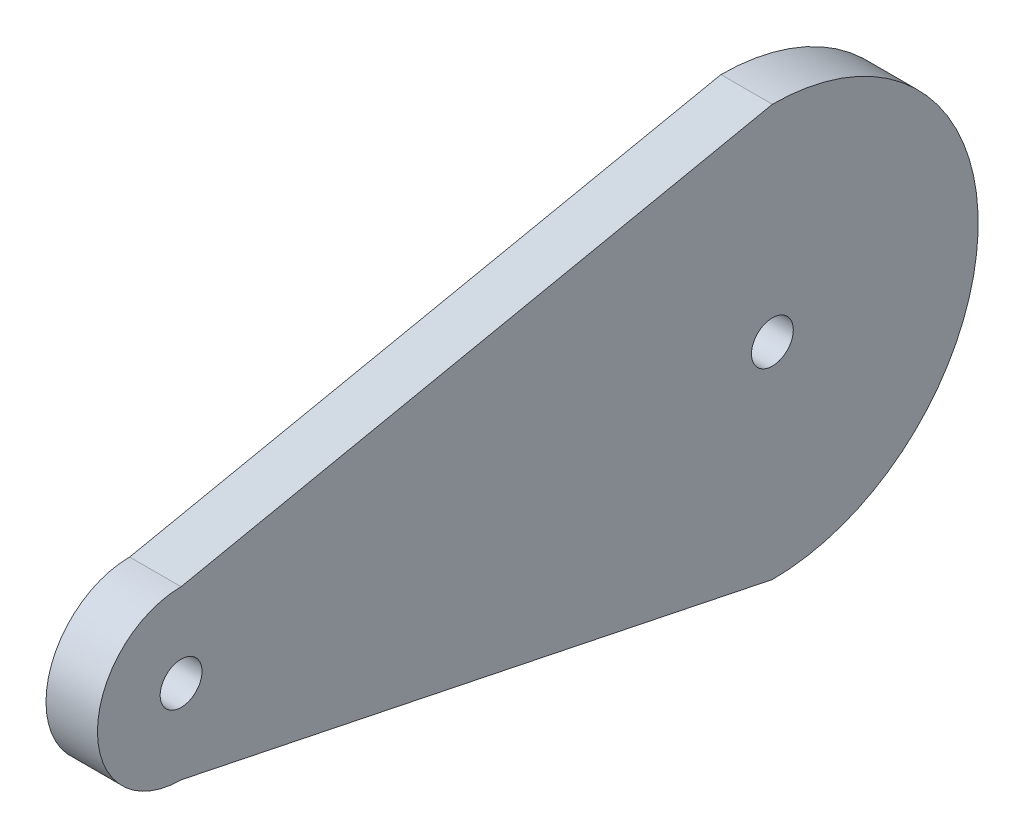
ISO-10303-21;
HEADER;
FILE_DESCRIPTION(('STEP AP214'),'2;1');
FILE_NAME('part.step','',(''),(''),'','','');
FILE_SCHEMA(('AUTOMOTIVE_DESIGN { 1 0 10303 214 1 1 1 1 }'));
ENDSEC;
DATA;
#1=APPLICATION_CONTEXT('core data for automotive mechanical design processes');
#2=APPLICATION_PROTOCOL_DEFINITION('international standard','automotive_design',2000,#1);
#3=PRODUCT_CONTEXT('',#1,'mechanical');
#4=PRODUCT('Part','Part','',(#3));
#5=PRODUCT_RELATED_PRODUCT_CATEGORY('part','',(#4));
#6=PRODUCT_DEFINITION_FORMATION('','',#4);
#7=PRODUCT_DEFINITION_CONTEXT('part definition',#1,'design');
#8=PRODUCT_DEFINITION('design','',#6,#7);
#9=PRODUCT_DEFINITION_SHAPE('','',#8);
#10=(LENGTH_UNIT() NAMED_UNIT(*) SI_UNIT(.MILLI.,.METRE.));
#11=(NAMED_UNIT(*) PLANE_ANGLE_UNIT() SI_UNIT($,.RADIAN.));
#12=(NAMED_UNIT(*) SI_UNIT($,.STERADIAN.) SOLID_ANGLE_UNIT());
#13=UNCERTAINTY_MEASURE_WITH_UNIT(LENGTH_MEASURE(1.E-05),#10,'distance_accuracy_value','');
#14=(GEOMETRIC_REPRESENTATION_CONTEXT(3) GLOBAL_UNCERTAINTY_ASSIGNED_CONTEXT((#13)) GLOBAL_UNIT_ASSIGNED_CONTEXT((#10,
#11,#12)) REPRESENTATION_CONTEXT('',''));
#15=CARTESIAN_POINT('',(0.,0.,0.));
#16=DIRECTION('',(0.,0.,1.));
#17=DIRECTION('',(1.,0.,0.));
#18=AXIS2_PLACEMENT_3D('',#15,#16,#17);
#19=CARTESIAN_POINT('',(6.35,-9.90068513488219,2.04551349423278));
#20=DIRECTION('',(0.,0.979317373878997,-0.202330129290586));
#21=DIRECTION('',(0.,0.202330129290586,0.979317373878997));
#22=AXIS2_PLACEMENT_3D('',#19,#20,#21);
#23=PLANE('',#22);
#24=DIRECTION('',(0.,-0.202330129290586,-0.979317373878997));
#25=VECTOR('',#24,1.);
#26=CARTESIAN_POINT('',(0.,-9.90068513488219,2.04551349423278));
#27=LINE('',#26,#25);
#28=CARTESIAN_POINT('',(0.,-10.3232948228064,0.));
#29=VERTEX_POINT('',#28);
#30=CARTESIAN_POINT('',(0.,-25.4,-72.9742));
#31=VERTEX_POINT('',#30);
#32=EDGE_CURVE('E117',#29,#31,#27,.T.);
#33=ORIENTED_EDGE('',*,*,#32,.T.);
#34=DIRECTION('',(-1.,0.,0.));
#35=VECTOR('',#34,1.);
#36=CARTESIAN_POINT('',(6.35,-25.4,-72.9742));
#37=LINE('',#36,#35);
#38=CARTESIAN_POINT('',(6.35,-25.4,-72.9742));
#39=VERTEX_POINT('',#38);
#40=EDGE_CURVE('E11',#39,#31,#37,.T.);
#41=ORIENTED_EDGE('',*,*,#40,.F.);
#42=DIRECTION('',(0.,-0.202330129290586,-0.979317373878997));
#43=VECTOR('',#42,1.);
#44=CARTESIAN_POINT('',(6.35,-9.90068513488219,2.04551349423278));
#45=LINE('',#44,#43);
#46=CARTESIAN_POINT('',(6.35,-10.3232948228064,0.));
#47=VERTEX_POINT('',#46);
#48=EDGE_CURVE('E90',#47,#39,#45,.T.);
#49=ORIENTED_EDGE('',*,*,#48,.F.);
#50=DIRECTION('',(-1.,0.,0.));
#51=VECTOR('',#50,1.);
#52=CARTESIAN_POINT('',(6.35,-10.3232948228064,0.));
#53=LINE('',#52,#51);
#54=EDGE_CURVE('E116',#47,#29,#53,.T.);
#55=ORIENTED_EDGE('',*,*,#54,.T.);
#56=EDGE_LOOP('',(#33,#41,#49,#55));
#57=FACE_BOUND('',#56,.T.);
#58=ADVANCED_FACE('F41',(#57),#23,.F.);
#59=CARTESIAN_POINT('',(6.35,0.,-72.9742));
#60=DIRECTION('',(-1.,0.,0.));
#61=DIRECTION('',(0.,0.,1.));
#62=AXIS2_PLACEMENT_3D('',#59,#60,#61);
#63=CYLINDRICAL_SURFACE('',#62,25.4);
#64=CARTESIAN_POINT('',(0.,0.,-72.9742));
#65=DIRECTION('',(1.,0.,0.));
#66=DIRECTION('',(0.,0.,-1.));
#67=AXIS2_PLACEMENT_3D('',#64,#65,#66);
#68=CIRCLE('',#67,25.4);
#69=CARTESIAN_POINT('',(0.,25.4,-72.9742));
#70=VERTEX_POINT('',#69);
#71=EDGE_CURVE('E96',#31,#70,#68,.T.);
#72=ORIENTED_EDGE('',*,*,#71,.T.);
#73=DIRECTION('',(-1.,0.,0.));
#74=VECTOR('',#73,1.);
#75=CARTESIAN_POINT('',(6.35,25.4,-72.9742));
#76=LINE('',#75,#74);
#77=CARTESIAN_POINT('',(6.35,25.4,-72.9742));
#78=VERTEX_POINT('',#77);
#79=EDGE_CURVE('E50',#78,#70,#76,.T.);
#80=ORIENTED_EDGE('',*,*,#79,.F.);
#81=CARTESIAN_POINT('',(6.35,0.,-72.9742));
#82=DIRECTION('',(1.,0.,0.));
#83=DIRECTION('',(0.,0.,-1.));
#84=AXIS2_PLACEMENT_3D('',#81,#82,#83);
#85=CIRCLE('',#84,25.4);
#86=EDGE_CURVE('E84',#39,#78,#85,.T.);
#87=ORIENTED_EDGE('',*,*,#86,.F.);
#88=ORIENTED_EDGE('',*,*,#40,.T.);
#89=EDGE_LOOP('',(#72,#80,#87,#88));
#90=FACE_BOUND('',#89,.T.);
#91=ADVANCED_FACE('F95',(#90),#63,.T.);
#92=CARTESIAN_POINT('',(6.35,9.90068513488219,2.04551349423278));
#93=DIRECTION('',(0.,0.979317373878997,0.202330129290586));
#94=DIRECTION('',(0.,-0.202330129290586,0.979317373878997));
#95=AXIS2_PLACEMENT_3D('',#92,#93,#94);
#96=PLANE('',#95);
#97=DIRECTION('',(0.,0.202330129290586,-0.979317373878997));
#98=VECTOR('',#97,1.);
#99=CARTESIAN_POINT('',(0.,9.90068513488219,2.04551349423278));
#100=LINE('',#99,#98);
#101=CARTESIAN_POINT('',(0.,10.3232948228064,0.));
#102=VERTEX_POINT('',#101);
#103=EDGE_CURVE('E123',#102,#70,#100,.T.);
#104=ORIENTED_EDGE('',*,*,#103,.F.);
#105=DIRECTION('',(-1.,0.,0.));
#106=VECTOR('',#105,1.);
#107=CARTESIAN_POINT('',(6.35,10.3232948228064,0.));
#108=LINE('',#107,#106);
#109=CARTESIAN_POINT('',(6.35,10.3232948228064,0.));
#110=VERTEX_POINT('',#109);
#111=EDGE_CURVE('E74',#110,#102,#108,.T.);
#112=ORIENTED_EDGE('',*,*,#111,.F.);
#113=DIRECTION('',(0.,0.202330129290586,-0.979317373878997));
#114=VECTOR('',#113,1.);
#115=CARTESIAN_POINT('',(6.35,9.90068513488219,2.04551349423278));
#116=LINE('',#115,#114);
#117=EDGE_CURVE('E88',#110,#78,#116,.T.);
#118=ORIENTED_EDGE('',*,*,#117,.T.);
#119=ORIENTED_EDGE('',*,*,#79,.T.);
#120=EDGE_LOOP('',(#104,#112,#118,#119));
#121=FACE_BOUND('',#120,.T.);
#122=ADVANCED_FACE('F101',(#121),#96,.T.);
#123=CARTESIAN_POINT('',(6.35,0.,0.));
#124=DIRECTION('',(-1.,0.,0.));
#125=DIRECTION('',(0.,0.,1.));
#126=AXIS2_PLACEMENT_3D('',#123,#124,#125);
#127=CYLINDRICAL_SURFACE('',#126,2.5808237057016);
#128=CARTESIAN_POINT('',(6.35,0.,0.));
#129=DIRECTION('',(1.,0.,0.));
#130=DIRECTION('',(0.,0.,-1.));
#131=AXIS2_PLACEMENT_3D('',#128,#129,#130);
#132=CIRCLE('',#131,2.5808237057016);
#133=CARTESIAN_POINT('',(6.35,0.,-2.5808237057016));
#134=VERTEX_POINT('',#133);
#135=EDGE_CURVE('E105',#134,#134,#132,.T.);
#136=ORIENTED_EDGE('',*,*,#135,.T.);
#137=EDGE_LOOP('',(#136));
#138=FACE_BOUND('',#137,.T.);
#139=CARTESIAN_POINT('',(0.,0.,0.));
#140=DIRECTION('',(1.,0.,0.));
#141=DIRECTION('',(0.,0.,-1.));
#142=AXIS2_PLACEMENT_3D('',#139,#140,#141);
#143=CIRCLE('',#142,2.5808237057016);
#144=CARTESIAN_POINT('',(0.,0.,-2.5808237057016));
#145=VERTEX_POINT('',#144);
#146=EDGE_CURVE('E128',#145,#145,#143,.T.);
#147=ORIENTED_EDGE('',*,*,#146,.F.);
#148=EDGE_LOOP('',(#147));
#149=FACE_BOUND('',#148,.T.);
#150=ADVANCED_FACE('F160',(#138,#149),#127,.F.);
#151=CARTESIAN_POINT('',(6.35,0.,0.));
#152=DIRECTION('',(-1.,0.,0.));
#153=DIRECTION('',(0.,0.,1.));
#154=AXIS2_PLACEMENT_3D('',#151,#152,#153);
#155=CYLINDRICAL_SURFACE('',#154,10.3232948228064);
#156=CARTESIAN_POINT('',(0.,0.,0.));
#157=DIRECTION('',(1.,0.,0.));
#158=DIRECTION('',(0.,0.,-1.));
#159=AXIS2_PLACEMENT_3D('',#156,#157,#158);
#160=CIRCLE('',#159,10.3232948228064);
#161=EDGE_CURVE('E77',#102,#29,#160,.T.);
#162=ORIENTED_EDGE('',*,*,#161,.T.);
#163=ORIENTED_EDGE('',*,*,#54,.F.);
#164=CARTESIAN_POINT('',(6.35,0.,0.));
#165=DIRECTION('',(1.,0.,0.));
#166=DIRECTION('',(0.,0.,-1.));
#167=AXIS2_PLACEMENT_3D('',#164,#165,#166);
#168=CIRCLE('',#167,10.3232948228064);
#169=EDGE_CURVE('E58',#110,#47,#168,.T.);
#170=ORIENTED_EDGE('',*,*,#169,.F.);
#171=ORIENTED_EDGE('',*,*,#111,.T.);
#172=EDGE_LOOP('',(#162,#163,#170,#171));
#173=FACE_BOUND('',#172,.T.);
#174=ADVANCED_FACE('F152',(#173),#155,.T.);
#175=CARTESIAN_POINT('',(6.35,0.,-72.9742));
#176=DIRECTION('',(-1.,0.,0.));
#177=DIRECTION('',(0.,0.,1.));
#178=AXIS2_PLACEMENT_3D('',#175,#176,#177);
#179=CYLINDRICAL_SURFACE('',#178,2.58082370570159);
#180=CARTESIAN_POINT('',(6.35,0.,-72.9742));
#181=DIRECTION('',(1.,0.,0.));
#182=DIRECTION('',(0.,0.,-1.));
#183=AXIS2_PLACEMENT_3D('',#180,#181,#182);
#184=CIRCLE('',#183,2.58082370570159);
#185=CARTESIAN_POINT('',(6.35,0.,-75.5550237057016));
#186=VERTEX_POINT('',#185);
#187=EDGE_CURVE('E112',#186,#186,#184,.T.);
#188=ORIENTED_EDGE('',*,*,#187,.T.);
#189=EDGE_LOOP('',(#188));
#190=FACE_BOUND('',#189,.T.);
#191=CARTESIAN_POINT('',(0.,0.,-72.9742));
#192=DIRECTION('',(1.,0.,0.));
#193=DIRECTION('',(0.,0.,-1.));
#194=AXIS2_PLACEMENT_3D('',#191,#192,#193);
#195=CIRCLE('',#194,2.58082370570159);
#196=CARTESIAN_POINT('',(0.,0.,-75.5550237057016));
#197=VERTEX_POINT('',#196);
#198=EDGE_CURVE('E132',#197,#197,#195,.T.);
#199=ORIENTED_EDGE('',*,*,#198,.F.);
#200=EDGE_LOOP('',(#199));
#201=FACE_BOUND('',#200,.T.);
#202=ADVANCED_FACE('F150',(#190,#201),#179,.F.);
#203=CARTESIAN_POINT('',(6.35,0.,0.));
#204=DIRECTION('',(1.,0.,0.));
#205=DIRECTION('',(0.,0.,-1.));
#206=AXIS2_PLACEMENT_3D('',#203,#204,#205);
#207=PLANE('',#206);
#208=ORIENTED_EDGE('',*,*,#48,.T.);
#209=ORIENTED_EDGE('',*,*,#86,.T.);
#210=ORIENTED_EDGE('',*,*,#117,.F.);
#211=ORIENTED_EDGE('',*,*,#169,.T.);
#212=EDGE_LOOP('',(#208,#209,#210,#211));
#213=FACE_BOUND('',#212,.T.);
#214=ORIENTED_EDGE('',*,*,#135,.F.);
#215=EDGE_LOOP('',(#214));
#216=FACE_BOUND('',#215,.T.);
#217=ORIENTED_EDGE('',*,*,#187,.F.);
#218=EDGE_LOOP('',(#217));
#219=FACE_BOUND('',#218,.T.);
#220=ADVANCED_FACE('F85',(#213,#216,#219),#207,.T.);
#221=CARTESIAN_POINT('',(0.,0.,0.));
#222=DIRECTION('',(1.,0.,0.));
#223=DIRECTION('',(0.,0.,-1.));
#224=AXIS2_PLACEMENT_3D('',#221,#222,#223);
#225=PLANE('',#224);
#226=ORIENTED_EDGE('',*,*,#32,.F.);
#227=ORIENTED_EDGE('',*,*,#161,.F.);
#228=ORIENTED_EDGE('',*,*,#103,.T.);
#229=ORIENTED_EDGE('',*,*,#71,.F.);
#230=EDGE_LOOP('',(#226,#227,#228,#229));
#231=FACE_BOUND('',#230,.T.);
#232=ORIENTED_EDGE('',*,*,#146,.T.);
#233=EDGE_LOOP('',(#232));
#234=FACE_BOUND('',#233,.T.);
#235=ORIENTED_EDGE('',*,*,#198,.T.);
#236=EDGE_LOOP('',(#235));
#237=FACE_BOUND('',#236,.T.);
#238=ADVANCED_FACE('F142',(#231,#234,#237),#225,.F.);
#239=CLOSED_SHELL('',(#58,#91,#122,#150,#174,#202,#220,#238));
#240=MANIFOLD_SOLID_BREP('B2',#239);
#241=ADVANCED_BREP_SHAPE_REPRESENTATION('',(#18,#240),#14);
#242=SHAPE_DEFINITION_REPRESENTATION(#9,#241);
ENDSEC;
END-ISO-10303-21;
